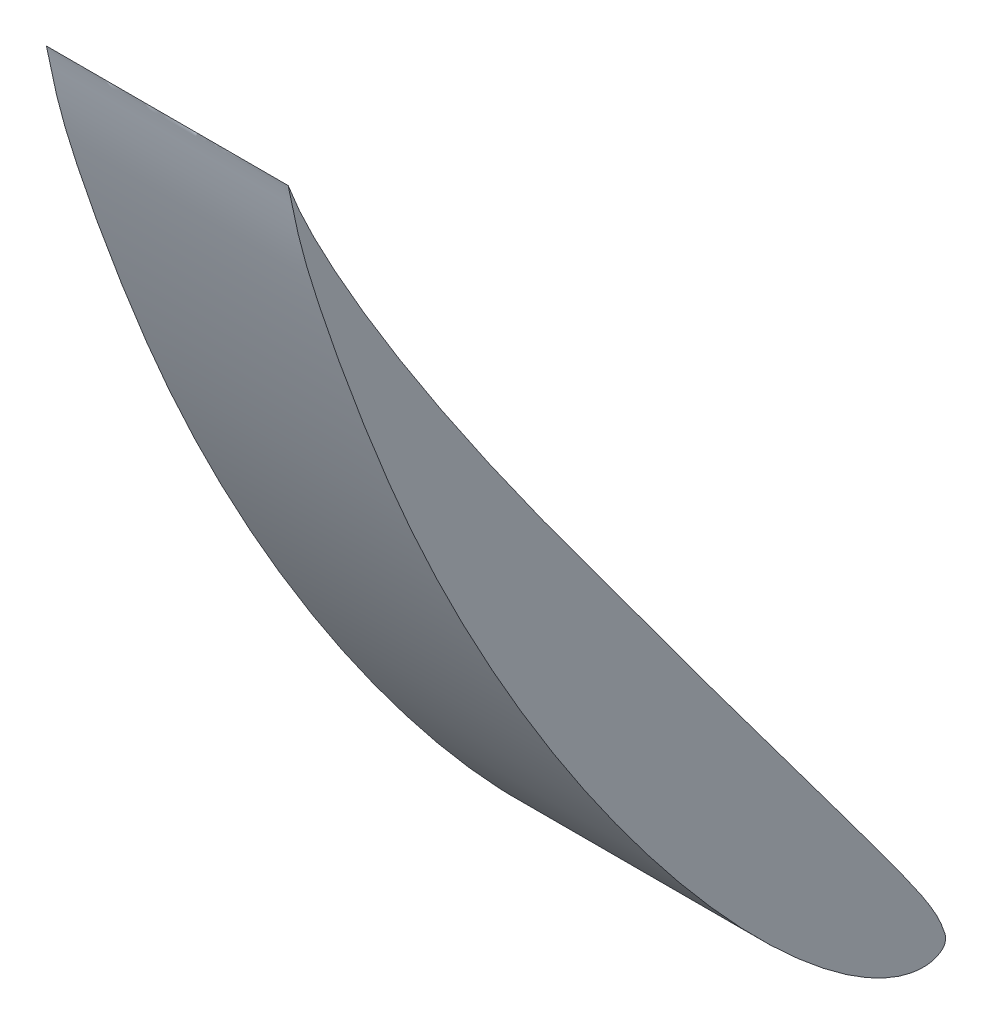
ISO-10303-21;
HEADER;
FILE_DESCRIPTION(('STEP AP214'),'2;1');
FILE_NAME('part.step','',(''),(''),'','','');
FILE_SCHEMA(('AUTOMOTIVE_DESIGN { 1 0 10303 214 1 1 1 1 }'));
ENDSEC;
DATA;
#1=APPLICATION_CONTEXT('core data for automotive mechanical design processes');
#2=APPLICATION_PROTOCOL_DEFINITION('international standard','automotive_design',2000,#1);
#3=PRODUCT_CONTEXT('',#1,'mechanical');
#4=PRODUCT('Part','Part','',(#3));
#5=PRODUCT_RELATED_PRODUCT_CATEGORY('part','',(#4));
#6=PRODUCT_DEFINITION_FORMATION('','',#4);
#7=PRODUCT_DEFINITION_CONTEXT('part definition',#1,'design');
#8=PRODUCT_DEFINITION('design','',#6,#7);
#9=PRODUCT_DEFINITION_SHAPE('','',#8);
#10=(LENGTH_UNIT() NAMED_UNIT(*) SI_UNIT(.MILLI.,.METRE.));
#11=(NAMED_UNIT(*) PLANE_ANGLE_UNIT() SI_UNIT($,.RADIAN.));
#12=(NAMED_UNIT(*) SI_UNIT($,.STERADIAN.) SOLID_ANGLE_UNIT());
#13=UNCERTAINTY_MEASURE_WITH_UNIT(LENGTH_MEASURE(1.E-05),#10,'distance_accuracy_value','');
#14=(GEOMETRIC_REPRESENTATION_CONTEXT(3) GLOBAL_UNCERTAINTY_ASSIGNED_CONTEXT((#13)) GLOBAL_UNIT_ASSIGNED_CONTEXT((#10,
#11,#12)) REPRESENTATION_CONTEXT('',''));
#15=CARTESIAN_POINT('',(0.,0.,0.));
#16=DIRECTION('',(0.,0.,1.));
#17=DIRECTION('',(1.,0.,0.));
#18=AXIS2_PLACEMENT_3D('',#15,#16,#17);
#19=CARTESIAN_POINT('',(30.,28.6639351055348,15.9181654392142));
#20=CARTESIAN_POINT('',(30.,28.6632425146671,15.9196903710125));
#21=CARTESIAN_POINT('',(30.,28.4668497113253,15.8649629714304));
#22=CARTESIAN_POINT('',(30.,28.2664644946753,15.8302691782348));
#23=CARTESIAN_POINT('',(30.,27.8049714073235,15.7338158289708));
#24=CARTESIAN_POINT('',(30.,27.2570277615976,15.6260942782079));
#25=CARTESIAN_POINT('',(30.,26.569129373108,15.4729406431417));
#26=CARTESIAN_POINT('',(30.,25.7773924848968,15.2676446040356));
#27=CARTESIAN_POINT('',(30.,24.8753457171611,15.0018831504981));
#28=CARTESIAN_POINT('',(30.,23.8665528653371,14.6839766505711));
#29=CARTESIAN_POINT('',(30.,22.7562150071353,14.3166336823586));
#30=CARTESIAN_POINT('',(30.,21.5545471435266,13.9013392803758));
#31=CARTESIAN_POINT('',(30.,20.2714053917747,13.4406422437037));
#32=CARTESIAN_POINT('',(30.,18.917744290523,12.9361207135057));
#33=CARTESIAN_POINT('',(30.,17.5048863276122,12.3898620854255));
#34=CARTESIAN_POINT('',(30.,16.0453675045239,11.8025913002422));
#35=CARTESIAN_POINT('',(30.,14.5502361185576,11.1748389281495));
#36=CARTESIAN_POINT('',(30.,13.0314908728805,10.4989063179664));
#37=CARTESIAN_POINT('',(30.,11.4963072595232,9.77698734322016));
#38=CARTESIAN_POINT('',(30.,9.9507106442534,9.01305656215015));
#39=CARTESIAN_POINT('',(30.,8.40417152853299,8.20621911104718));
#40=CARTESIAN_POINT('',(30.,6.86249101415944,7.36303434686076));
#41=CARTESIAN_POINT('',(30.,5.33408196475111,6.48567152408324));
#42=CARTESIAN_POINT('',(30.,3.82779610714965,5.57746712623823));
#43=CARTESIAN_POINT('',(30.,2.34938700155934,4.64580424425197));
#44=CARTESIAN_POINT('',(30.,0.908059236494756,3.69244105126036));
#45=CARTESIAN_POINT('',(30.,-0.489610543685671,2.72368997396996));
#46=CARTESIAN_POINT('',(30.,-1.83716907975137,1.74543721300596));
#47=CARTESIAN_POINT('',(30.,-3.12729875021838,0.762712417270196));
#48=CARTESIAN_POINT('',(30.,-4.3542348915966,-0.217852133674001));
#49=CARTESIAN_POINT('',(30.,-5.51149031391383,-1.1910194305279));
#50=CARTESIAN_POINT('',(30.,-6.59307825112603,-2.15101988633311));
#51=CARTESIAN_POINT('',(30.,-7.59476174534598,-3.0911040417701));
#52=CARTESIAN_POINT('',(30.,-8.51091037182268,-4.00676867642333));
#53=CARTESIAN_POINT('',(30.,-9.33784243397123,-4.89174073879311));
#54=CARTESIAN_POINT('',(30.,-10.0725400041424,-5.74030668779594));
#55=CARTESIAN_POINT('',(30.,-10.7110101715486,-6.54784937260567));
#56=CARTESIAN_POINT('',(30.,-11.2536192691204,-7.3075483895869));
#57=CARTESIAN_POINT('',(30.,-11.6960957338561,-8.01785684402911));
#58=CARTESIAN_POINT('',(30.,-12.0372232575893,-8.6743284725207));
#59=CARTESIAN_POINT('',(30.,-12.2858100195164,-9.26990406221837));
#60=CARTESIAN_POINT('',(30.,-12.4348989612548,-9.80616846478255));
#61=CARTESIAN_POINT('',(30.,-12.4934922553893,-10.2729786119293));
#62=CARTESIAN_POINT('',(30.,-12.4711649667296,-10.6725599650109));
#63=CARTESIAN_POINT('',(30.,-12.354405011384,-10.9815401091681));
#64=CARTESIAN_POINT('',(30.,-12.1874058845229,-11.2303206328867));
#65=CARTESIAN_POINT('',(30.,-11.878363665674,-11.3082625043273));
#66=CARTESIAN_POINT('',(30.,-11.5185205567481,-11.1869768252298));
#67=CARTESIAN_POINT('',(30.,-11.0522973345341,-11.0000190354619));
#68=CARTESIAN_POINT('',(30.,-10.4802050586076,-10.6787532769698));
#69=CARTESIAN_POINT('',(30.,-9.80118481426976,-10.2445764928086));
#70=CARTESIAN_POINT('',(30.,-9.00941873899899,-9.69727790359089));
#71=CARTESIAN_POINT('',(30.,-8.10490938840917,-9.04583314869695));
#72=CARTESIAN_POINT('',(30.,-7.08988595713173,-8.29932579316901));
#73=CARTESIAN_POINT('',(30.,-5.96989458012448,-7.46670676760146));
#74=CARTESIAN_POINT('',(30.,-4.75220716122933,-6.55569547055394));
#75=CARTESIAN_POINT('',(30.,-3.44373936078565,-5.5758982073604));
#76=CARTESIAN_POINT('',(30.,-2.05348781363962,-4.53556864257908));
#77=CARTESIAN_POINT('',(30.,-0.590271118320278,-3.44435406329583));
#78=CARTESIAN_POINT('',(30.,0.935495090725847,-2.31082088938769));
#79=CARTESIAN_POINT('',(30.,2.51306858721731,-1.1441220294843));
#80=CARTESIAN_POINT('',(30.,4.13129076772674,0.0472557072358762));
#81=CARTESIAN_POINT('',(30.,5.77790027987896,1.2578415802028));
#82=CARTESIAN_POINT('',(30.,7.44176751510887,2.48458034383513));
#83=CARTESIAN_POINT('',(30.,9.11787734318806,3.71882626581569));
#84=CARTESIAN_POINT('',(30.,10.8002042999971,4.9507848502182));
#85=CARTESIAN_POINT('',(30.,12.4834060678618,6.16238112623692));
#86=CARTESIAN_POINT('',(30.,14.1554065619349,7.33877906374697));
#87=CARTESIAN_POINT('',(30.,15.7996778259718,8.47125946421613));
#88=CARTESIAN_POINT('',(30.,17.4028273497819,9.54925002694061));
#89=CARTESIAN_POINT('',(30.,18.9516748565125,10.5633600073624));
#90=CARTESIAN_POINT('',(30.,20.4327244500268,11.5049467294537));
#91=CARTESIAN_POINT('',(30.,21.8324021351956,12.3661122880019));
#92=CARTESIAN_POINT('',(30.,23.1371154703315,13.1403921053784));
#93=CARTESIAN_POINT('',(30.,24.333038352982,13.8219751977062));
#94=CARTESIAN_POINT('',(30.,25.4083585498835,14.4074436812296));
#95=CARTESIAN_POINT('',(30.,26.345761135367,14.8929939164176));
#96=CARTESIAN_POINT('',(30.,27.1455997872212,15.2803766551502));
#97=CARTESIAN_POINT('',(30.,27.7591384285775,15.5576066747195));
#98=CARTESIAN_POINT('',(30.,28.2613332924992,15.7593946704727));
#99=CARTESIAN_POINT('',(30.,28.4632748596242,15.8465787860585));
#100=CARTESIAN_POINT('',(30.,28.6646345962756,15.9166253154225));
#101=CARTESIAN_POINT('',(30.,28.6639351055348,15.9181654392142));
#102=B_SPLINE_CURVE_WITH_KNOTS('',3,(#19,#20,#21,#22,#23,#24,#25,#26,#27,#28,#29,#30,#31,#32,
#33,#34,#35,#36,#37,#38,#39,#40,#41,#42,#43,#44,#45,#46,#47,#48,#49,#50,#51,#52,#53,#54,#55,#56,
#57,#58,#59,#60,#61,#62,#63,#64,#65,#66,#67,#68,#69,#70,#71,#72,#73,#74,#75,#76,#77,#78,#79,#80,
#81,#82,#83,#84,#85,#86,#87,#88,#89,#90,#91,#92,#93,#94,#95,#96,#97,#98,#99,#100,#101),
.UNSPECIFIED.,.T.,.F.,(4,1,1,1,1,1,1,1,1,1,1,1,1,1,1,1,1,1,1,1,1,1,1,1,1,1,1,1,1,1,1,1,1,1,1,1,
1,1,1,1,1,1,1,1,1,1,1,1,1,1,1,1,1,1,1,1,1,1,1,1,1,1,1,1,1,1,1,1,1,1,1,1,1,1,1,1,1,1,1,1,4),(0.,
0.000978925200277523,0.00378591549023065,0.00817878586970806,0.013939635702595,
0.0209145841543321,0.0290565975621916,0.0384135587113586,0.0489739715715674,0.0606454194024026,
0.0733338505321345,0.0869390748188674,0.101355022510081,0.116470864670873,0.132170766848875,
0.148332165360985,0.164889947509331,0.181806831021788,0.198986828660527,0.216369092592438,
0.233891214474879,0.25145520462322,0.268989943534912,0.286410198751259,0.30363306022829,
0.320588512817723,0.337187269596329,0.353353473374656,0.36901233500621,0.384083454981518,
0.398499749186594,0.412191496678254,0.425098469382076,0.437171363117539,0.448351495068995,
0.458605678988818,0.467900990608339,0.476215592972652,0.48357299062513,0.489970137349999,
0.495456443583994,0.500131702922335,0.503991848386412,0.507230007900312,0.509986766870744,
0.512500662152879,0.516073685181018,0.521095012002638,0.527571392405466,0.535587320266657,
0.545177110955054,0.556301642956373,0.568874715443027,0.582800205502828,0.597975201944564,
0.614286016356003,0.631612678153747,0.649825892256692,0.668791608390084,0.688371085664615,
0.708416852810966,0.728796853365483,0.749399048787055,0.770145767160638,0.790953093304618,
0.811664203475039,0.832074040882522,0.851999343771334,0.871281671964732,0.889760566338039,
0.907279933600535,0.923686413750604,0.938832510110946,0.952579326689716,0.964796492179185,
0.975364982161422,0.984179191960217,0.991107071249204,0.996049394239127,0.999011322347036,1.),.UNSPECIFIED.);
#103=DIRECTION('',(-1.,0.,0.));
#104=VECTOR('',#103,1.);
#105=SURFACE_OF_LINEAR_EXTRUSION('',#102,#104);
#106=CARTESIAN_POINT('',(30.,28.6639351055348,15.9181654392142));
#107=VERTEX_POINT('',#106);
#108=EDGE_CURVE('E10',#107,#107,#102,.T.);
#109=ORIENTED_EDGE('',*,*,#108,.F.);
#110=EDGE_LOOP('',(#109));
#111=FACE_BOUND('',#110,.T.);
#112=CARTESIAN_POINT('',(20.,28.6639351055348,15.9181654392142));
#113=CARTESIAN_POINT('',(20.,28.6632425146671,15.9196903710125));
#114=CARTESIAN_POINT('',(20.,28.4668497113253,15.8649629714304));
#115=CARTESIAN_POINT('',(20.,28.2664644946753,15.8302691782348));
#116=CARTESIAN_POINT('',(20.,27.8049714073235,15.7338158289708));
#117=CARTESIAN_POINT('',(20.,27.2570277615976,15.6260942782079));
#118=CARTESIAN_POINT('',(20.,26.569129373108,15.4729406431417));
#119=CARTESIAN_POINT('',(20.,25.7773924848968,15.2676446040356));
#120=CARTESIAN_POINT('',(20.,24.8753457171611,15.0018831504981));
#121=CARTESIAN_POINT('',(20.,23.8665528653371,14.6839766505711));
#122=CARTESIAN_POINT('',(20.,22.7562150071353,14.3166336823586));
#123=CARTESIAN_POINT('',(20.,21.5545471435266,13.9013392803758));
#124=CARTESIAN_POINT('',(20.,20.2714053917747,13.4406422437037));
#125=CARTESIAN_POINT('',(20.,18.917744290523,12.9361207135057));
#126=CARTESIAN_POINT('',(20.,17.5048863276122,12.3898620854255));
#127=CARTESIAN_POINT('',(20.,16.0453675045239,11.8025913002422));
#128=CARTESIAN_POINT('',(20.,14.5502361185576,11.1748389281495));
#129=CARTESIAN_POINT('',(20.,13.0314908728805,10.4989063179664));
#130=CARTESIAN_POINT('',(20.,11.4963072595232,9.77698734322016));
#131=CARTESIAN_POINT('',(20.,9.9507106442534,9.01305656215015));
#132=CARTESIAN_POINT('',(20.,8.40417152853299,8.20621911104718));
#133=CARTESIAN_POINT('',(20.,6.86249101415944,7.36303434686076));
#134=CARTESIAN_POINT('',(20.,5.33408196475111,6.48567152408324));
#135=CARTESIAN_POINT('',(20.,3.82779610714965,5.57746712623823));
#136=CARTESIAN_POINT('',(20.,2.34938700155934,4.64580424425197));
#137=CARTESIAN_POINT('',(20.,0.908059236494756,3.69244105126036));
#138=CARTESIAN_POINT('',(20.,-0.48961054368567,2.72368997396996));
#139=CARTESIAN_POINT('',(20.,-1.83716907975137,1.74543721300596));
#140=CARTESIAN_POINT('',(20.,-3.12729875021838,0.762712417270196));
#141=CARTESIAN_POINT('',(20.,-4.3542348915966,-0.217852133674001));
#142=CARTESIAN_POINT('',(20.,-5.51149031391383,-1.1910194305279));
#143=CARTESIAN_POINT('',(20.,-6.59307825112603,-2.15101988633311));
#144=CARTESIAN_POINT('',(20.,-7.59476174534598,-3.0911040417701));
#145=CARTESIAN_POINT('',(20.,-8.51091037182268,-4.00676867642333));
#146=CARTESIAN_POINT('',(20.,-9.33784243397123,-4.89174073879311));
#147=CARTESIAN_POINT('',(20.,-10.0725400041424,-5.74030668779594));
#148=CARTESIAN_POINT('',(20.,-10.7110101715486,-6.54784937260567));
#149=CARTESIAN_POINT('',(20.,-11.2536192691204,-7.3075483895869));
#150=CARTESIAN_POINT('',(20.,-11.6960957338561,-8.01785684402911));
#151=CARTESIAN_POINT('',(20.,-12.0372232575893,-8.6743284725207));
#152=CARTESIAN_POINT('',(20.,-12.2858100195164,-9.26990406221837));
#153=CARTESIAN_POINT('',(20.,-12.4348989612548,-9.80616846478255));
#154=CARTESIAN_POINT('',(20.,-12.4934922553893,-10.2729786119293));
#155=CARTESIAN_POINT('',(20.,-12.4711649667296,-10.6725599650109));
#156=CARTESIAN_POINT('',(20.,-12.354405011384,-10.9815401091681));
#157=CARTESIAN_POINT('',(20.,-12.1874058845229,-11.2303206328867));
#158=CARTESIAN_POINT('',(20.,-11.878363665674,-11.3082625043273));
#159=CARTESIAN_POINT('',(20.,-11.5185205567481,-11.1869768252298));
#160=CARTESIAN_POINT('',(20.,-11.0522973345341,-11.0000190354619));
#161=CARTESIAN_POINT('',(20.,-10.4802050586076,-10.6787532769698));
#162=CARTESIAN_POINT('',(20.,-9.80118481426976,-10.2445764928086));
#163=CARTESIAN_POINT('',(20.,-9.00941873899899,-9.69727790359089));
#164=CARTESIAN_POINT('',(20.,-8.10490938840917,-9.04583314869695));
#165=CARTESIAN_POINT('',(20.,-7.08988595713173,-8.29932579316901));
#166=CARTESIAN_POINT('',(20.,-5.96989458012448,-7.46670676760146));
#167=CARTESIAN_POINT('',(20.,-4.75220716122933,-6.55569547055394));
#168=CARTESIAN_POINT('',(20.,-3.44373936078565,-5.5758982073604));
#169=CARTESIAN_POINT('',(20.,-2.05348781363962,-4.53556864257908));
#170=CARTESIAN_POINT('',(20.,-0.590271118320278,-3.44435406329583));
#171=CARTESIAN_POINT('',(20.,0.935495090725848,-2.31082088938769));
#172=CARTESIAN_POINT('',(20.,2.51306858721731,-1.1441220294843));
#173=CARTESIAN_POINT('',(20.,4.13129076772674,0.0472557072358762));
#174=CARTESIAN_POINT('',(20.,5.77790027987896,1.2578415802028));
#175=CARTESIAN_POINT('',(20.,7.44176751510887,2.48458034383513));
#176=CARTESIAN_POINT('',(20.,9.11787734318806,3.71882626581569));
#177=CARTESIAN_POINT('',(20.,10.8002042999971,4.9507848502182));
#178=CARTESIAN_POINT('',(20.,12.4834060678618,6.16238112623692));
#179=CARTESIAN_POINT('',(20.,14.1554065619349,7.33877906374697));
#180=CARTESIAN_POINT('',(20.,15.7996778259718,8.47125946421613));
#181=CARTESIAN_POINT('',(20.,17.4028273497819,9.54925002694061));
#182=CARTESIAN_POINT('',(20.,18.9516748565125,10.5633600073624));
#183=CARTESIAN_POINT('',(20.,20.4327244500268,11.5049467294537));
#184=CARTESIAN_POINT('',(20.,21.8324021351956,12.3661122880019));
#185=CARTESIAN_POINT('',(20.,23.1371154703315,13.1403921053784));
#186=CARTESIAN_POINT('',(20.,24.333038352982,13.8219751977062));
#187=CARTESIAN_POINT('',(20.,25.4083585498835,14.4074436812296));
#188=CARTESIAN_POINT('',(20.,26.345761135367,14.8929939164176));
#189=CARTESIAN_POINT('',(20.,27.1455997872212,15.2803766551502));
#190=CARTESIAN_POINT('',(20.,27.7591384285775,15.5576066747195));
#191=CARTESIAN_POINT('',(20.,28.2613332924992,15.7593946704727));
#192=CARTESIAN_POINT('',(20.,28.4632748596242,15.8465787860585));
#193=CARTESIAN_POINT('',(20.,28.6646345962756,15.9166253154225));
#194=CARTESIAN_POINT('',(20.,28.6639351055348,15.9181654392142));
#195=B_SPLINE_CURVE_WITH_KNOTS('',3,(#112,#113,#114,#115,#116,#117,#118,#119,#120,#121,#122,
#123,#124,#125,#126,#127,#128,#129,#130,#131,#132,#133,#134,#135,#136,#137,#138,#139,#140,#141,
#142,#143,#144,#145,#146,#147,#148,#149,#150,#151,#152,#153,#154,#155,#156,#157,#158,#159,#160,
#161,#162,#163,#164,#165,#166,#167,#168,#169,#170,#171,#172,#173,#174,#175,#176,#177,#178,#179,
#180,#181,#182,#183,#184,#185,#186,#187,#188,#189,#190,#191,#192,#193,#194),.UNSPECIFIED.,.T.,
.F.,(4,1,1,1,1,1,1,1,1,1,1,1,1,1,1,1,1,1,1,1,1,1,1,1,1,1,1,1,1,1,1,1,1,1,1,1,1,1,1,1,1,1,1,1,1,
1,1,1,1,1,1,1,1,1,1,1,1,1,1,1,1,1,1,1,1,1,1,1,1,1,1,1,1,1,1,1,1,1,1,1,4),(0.,
0.000978925200277523,0.00378591549023065,0.00817878586970806,0.013939635702595,
0.0209145841543321,0.0290565975621916,0.0384135587113586,0.0489739715715674,0.0606454194024026,
0.0733338505321345,0.0869390748188674,0.101355022510081,0.116470864670873,0.132170766848875,
0.148332165360985,0.164889947509331,0.181806831021788,0.198986828660527,0.216369092592438,
0.233891214474879,0.25145520462322,0.268989943534912,0.286410198751259,0.30363306022829,
0.320588512817723,0.337187269596329,0.353353473374656,0.36901233500621,0.384083454981518,
0.398499749186594,0.412191496678254,0.425098469382076,0.437171363117539,0.448351495068995,
0.458605678988818,0.467900990608339,0.476215592972652,0.48357299062513,0.489970137349999,
0.495456443583994,0.500131702922335,0.503991848386412,0.507230007900312,0.509986766870744,
0.512500662152879,0.516073685181018,0.521095012002638,0.527571392405466,0.535587320266657,
0.545177110955054,0.556301642956373,0.568874715443027,0.582800205502828,0.597975201944564,
0.614286016356003,0.631612678153747,0.649825892256692,0.668791608390084,0.688371085664615,
0.708416852810966,0.728796853365483,0.749399048787055,0.770145767160638,0.790953093304618,
0.811664203475039,0.832074040882522,0.851999343771334,0.871281671964732,0.889760566338039,
0.907279933600535,0.923686413750604,0.938832510110946,0.952579326689716,0.964796492179185,
0.975364982161422,0.984179191960217,0.991107071249204,0.996049394239127,0.999011322347036,1.),.UNSPECIFIED.);
#196=CARTESIAN_POINT('',(20.,28.6639351055348,15.9181654392142));
#197=VERTEX_POINT('',#196);
#198=EDGE_CURVE('E41',#197,#197,#195,.T.);
#199=ORIENTED_EDGE('',*,*,#198,.T.);
#200=EDGE_LOOP('',(#199));
#201=FACE_BOUND('',#200,.T.);
#202=ADVANCED_FACE('F37',(#111,#201),#105,.F.);
#203=CARTESIAN_POINT('',(30.,-12.4809675657853,-10.2884819927035));
#204=DIRECTION('',(-1.,0.,0.));
#205=DIRECTION('',(0.,0.,1.));
#206=AXIS2_PLACEMENT_3D('',#203,#204,#205);
#207=PLANE('',#206);
#208=ORIENTED_EDGE('',*,*,#108,.T.);
#209=EDGE_LOOP('',(#208));
#210=FACE_BOUND('',#209,.T.);
#211=ADVANCED_FACE('F60',(#210),#207,.F.);
#212=CARTESIAN_POINT('',(20.,-12.4809675657853,-10.2884819927035));
#213=DIRECTION('',(-1.,0.,0.));
#214=DIRECTION('',(0.,0.,1.));
#215=AXIS2_PLACEMENT_3D('',#212,#213,#214);
#216=PLANE('',#215);
#217=ORIENTED_EDGE('',*,*,#198,.F.);
#218=EDGE_LOOP('',(#217));
#219=FACE_BOUND('',#218,.T.);
#220=ADVANCED_FACE('F58',(#219),#216,.T.);
#221=CLOSED_SHELL('',(#202,#211,#220));
#222=MANIFOLD_SOLID_BREP('B2',#221);
#223=ADVANCED_BREP_SHAPE_REPRESENTATION('',(#18,#222),#14);
#224=SHAPE_DEFINITION_REPRESENTATION(#9,#223);
ENDSEC;
END-ISO-10303-21;
